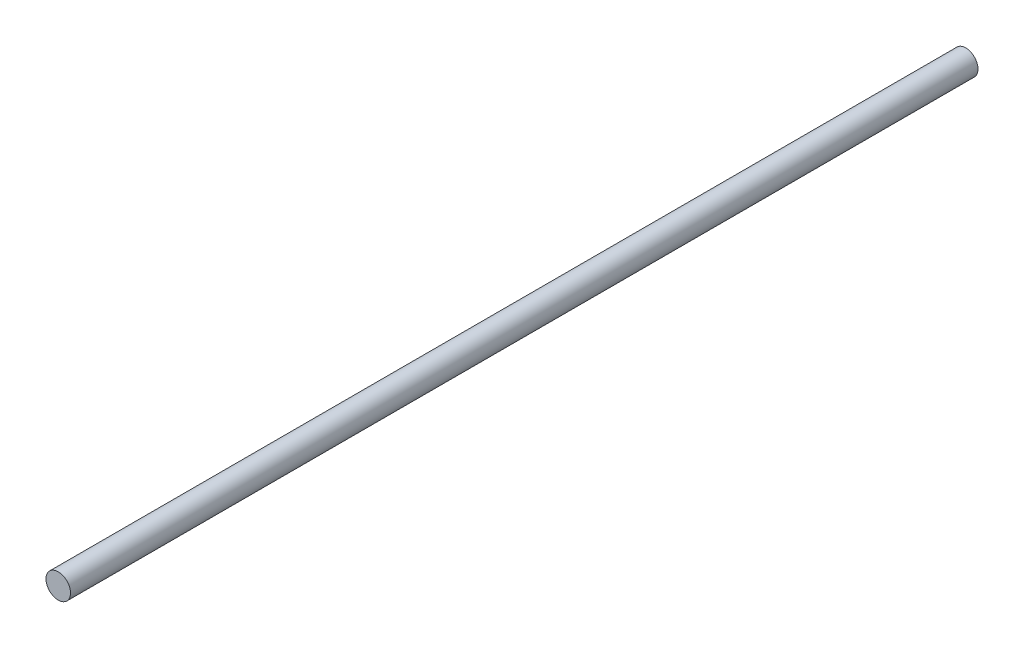
ISO-10303-21;
HEADER;
FILE_DESCRIPTION(('STEP AP214'),'2;1');
FILE_NAME('part.step','',(''),(''),'','','');
FILE_SCHEMA(('AUTOMOTIVE_DESIGN { 1 0 10303 214 1 1 1 1 }'));
ENDSEC;
DATA;
#1=APPLICATION_CONTEXT('core data for automotive mechanical design processes');
#2=APPLICATION_PROTOCOL_DEFINITION('international standard','automotive_design',2000,#1);
#3=PRODUCT_CONTEXT('',#1,'mechanical');
#4=PRODUCT('Part','Part','',(#3));
#5=PRODUCT_RELATED_PRODUCT_CATEGORY('part','',(#4));
#6=PRODUCT_DEFINITION_FORMATION('','',#4);
#7=PRODUCT_DEFINITION_CONTEXT('part definition',#1,'design');
#8=PRODUCT_DEFINITION('design','',#6,#7);
#9=PRODUCT_DEFINITION_SHAPE('','',#8);
#10=(LENGTH_UNIT() NAMED_UNIT(*) SI_UNIT(.MILLI.,.METRE.));
#11=(NAMED_UNIT(*) PLANE_ANGLE_UNIT() SI_UNIT($,.RADIAN.));
#12=(NAMED_UNIT(*) SI_UNIT($,.STERADIAN.) SOLID_ANGLE_UNIT());
#13=UNCERTAINTY_MEASURE_WITH_UNIT(LENGTH_MEASURE(1.E-05),#10,'distance_accuracy_value','');
#14=(GEOMETRIC_REPRESENTATION_CONTEXT(3) GLOBAL_UNCERTAINTY_ASSIGNED_CONTEXT((#13)) GLOBAL_UNIT_ASSIGNED_CONTEXT((#10,
#11,#12)) REPRESENTATION_CONTEXT('',''));
#15=CARTESIAN_POINT('',(0.,0.,0.));
#16=DIRECTION('',(0.,0.,1.));
#17=DIRECTION('',(1.,0.,0.));
#18=AXIS2_PLACEMENT_3D('',#15,#16,#17);
#19=CARTESIAN_POINT('',(0.,0.,17.9));
#20=DIRECTION('',(0.,0.,-1.));
#21=DIRECTION('',(-1.,0.,0.));
#22=AXIS2_PLACEMENT_3D('',#19,#20,#21);
#23=PLANE('',#22);
#24=CARTESIAN_POINT('',(0.,0.,17.9));
#25=DIRECTION('',(0.,0.,1.));
#26=DIRECTION('',(1.,0.,0.));
#27=AXIS2_PLACEMENT_3D('',#24,#25,#26);
#28=CIRCLE('',#27,4.);
#29=CARTESIAN_POINT('',(4.,0.,17.9));
#30=VERTEX_POINT('',#29);
#31=EDGE_CURVE('E10',#30,#30,#28,.T.);
#32=ORIENTED_EDGE('',*,*,#31,.T.);
#33=EDGE_LOOP('',(#32));
#34=FACE_BOUND('',#33,.T.);
#35=ADVANCED_FACE('F34',(#34),#23,.F.);
#36=CARTESIAN_POINT('',(0.,0.,17.9));
#37=DIRECTION('',(0.,0.,1.));
#38=DIRECTION('',(1.,0.,0.));
#39=AXIS2_PLACEMENT_3D('',#36,#37,#38);
#40=CYLINDRICAL_SURFACE('',#39,4.);
#41=ORIENTED_EDGE('',*,*,#31,.F.);
#42=EDGE_LOOP('',(#41));
#43=FACE_BOUND('',#42,.T.);
#44=CARTESIAN_POINT('',(0.,0.,-277.9));
#45=DIRECTION('',(0.,0.,1.));
#46=DIRECTION('',(1.,0.,0.));
#47=AXIS2_PLACEMENT_3D('',#44,#45,#46);
#48=CIRCLE('',#47,4.);
#49=CARTESIAN_POINT('',(4.,0.,-277.9));
#50=VERTEX_POINT('',#49);
#51=EDGE_CURVE('E40',#50,#50,#48,.T.);
#52=ORIENTED_EDGE('',*,*,#51,.T.);
#53=EDGE_LOOP('',(#52));
#54=FACE_BOUND('',#53,.T.);
#55=ADVANCED_FACE('F46',(#43,#54),#40,.T.);
#56=CARTESIAN_POINT('',(0.,0.,-277.9));
#57=DIRECTION('',(0.,0.,1.));
#58=DIRECTION('',(1.,0.,0.));
#59=AXIS2_PLACEMENT_3D('',#56,#57,#58);
#60=PLANE('',#59);
#61=ORIENTED_EDGE('',*,*,#51,.F.);
#62=EDGE_LOOP('',(#61));
#63=FACE_BOUND('',#62,.T.);
#64=ADVANCED_FACE('F48',(#63),#60,.F.);
#65=CLOSED_SHELL('',(#35,#55,#64));
#66=MANIFOLD_SOLID_BREP('B2',#65);
#67=ADVANCED_BREP_SHAPE_REPRESENTATION('',(#18,#66),#14);
#68=SHAPE_DEFINITION_REPRESENTATION(#9,#67);
ENDSEC;
END-ISO-10303-21;
